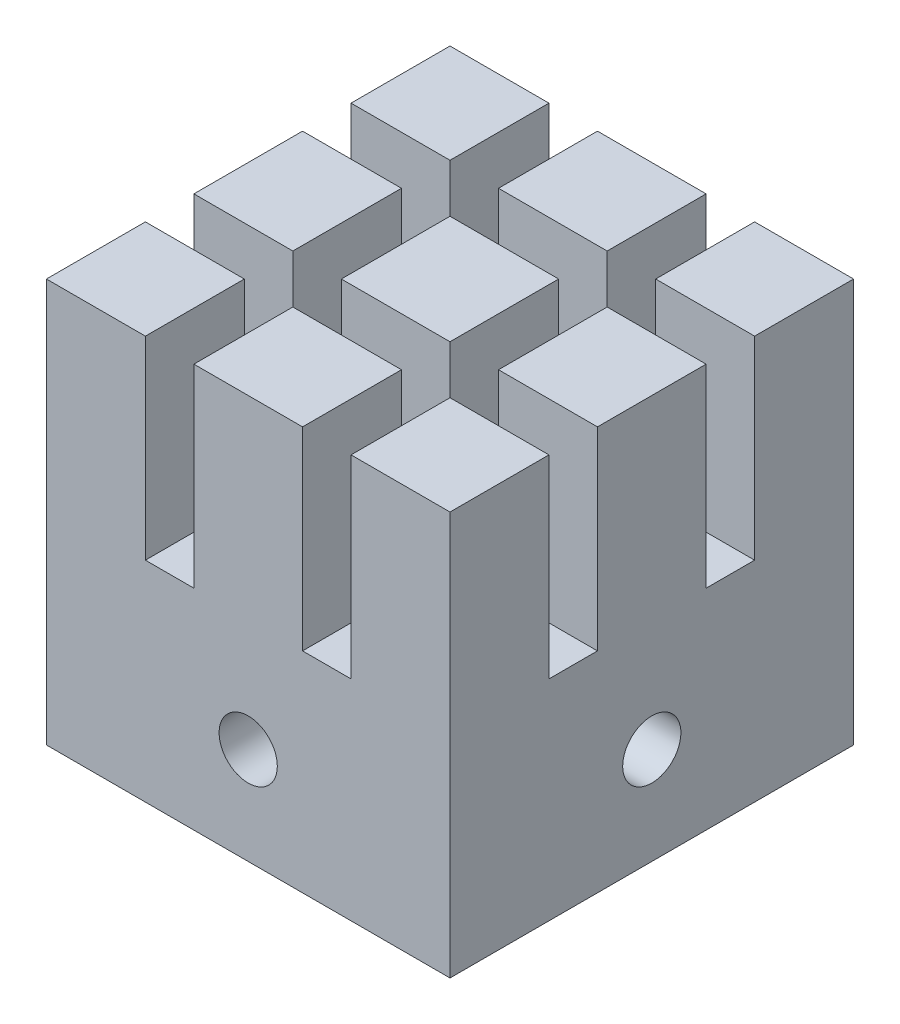
ISO-10303-21;
HEADER;
FILE_DESCRIPTION(('STEP AP214'),'2;1');
FILE_NAME('part.step','',(''),(''),'','','');
FILE_SCHEMA(('AUTOMOTIVE_DESIGN { 1 0 10303 214 1 1 1 1 }'));
ENDSEC;
DATA;
#1=APPLICATION_CONTEXT('core data for automotive mechanical design processes');
#2=APPLICATION_PROTOCOL_DEFINITION('international standard','automotive_design',2000,#1);
#3=PRODUCT_CONTEXT('',#1,'mechanical');
#4=PRODUCT('Part','Part','',(#3));
#5=PRODUCT_RELATED_PRODUCT_CATEGORY('part','',(#4));
#6=PRODUCT_DEFINITION_FORMATION('','',#4);
#7=PRODUCT_DEFINITION_CONTEXT('part definition',#1,'design');
#8=PRODUCT_DEFINITION('design','',#6,#7);
#9=PRODUCT_DEFINITION_SHAPE('','',#8);
#10=(LENGTH_UNIT() NAMED_UNIT(*) SI_UNIT(.MILLI.,.METRE.));
#11=(NAMED_UNIT(*) PLANE_ANGLE_UNIT() SI_UNIT($,.RADIAN.));
#12=(NAMED_UNIT(*) SI_UNIT($,.STERADIAN.) SOLID_ANGLE_UNIT());
#13=UNCERTAINTY_MEASURE_WITH_UNIT(LENGTH_MEASURE(1.E-05),#10,'distance_accuracy_value','');
#14=(GEOMETRIC_REPRESENTATION_CONTEXT(3) GLOBAL_UNCERTAINTY_ASSIGNED_CONTEXT((#13)) GLOBAL_UNIT_ASSIGNED_CONTEXT((#10,
#11,#12)) REPRESENTATION_CONTEXT('',''));
#15=CARTESIAN_POINT('',(0.,0.,0.));
#16=DIRECTION('',(0.,0.,1.));
#17=DIRECTION('',(1.,0.,0.));
#18=AXIS2_PLACEMENT_3D('',#15,#16,#17);
#19=CARTESIAN_POINT('',(5.08,-7.366,-26.416));
#20=DIRECTION('',(0.,0.,1.));
#21=DIRECTION('',(1.,0.,0.));
#22=AXIS2_PLACEMENT_3D('',#19,#20,#21);
#23=CYLINDRICAL_SURFACE('',#22,1.905);
#24=CARTESIAN_POINT('',(5.08,-7.366,0.));
#25=DIRECTION('',(0.,0.,1.));
#26=DIRECTION('',(1.,0.,0.));
#27=AXIS2_PLACEMENT_3D('',#24,#25,#26);
#28=CIRCLE('',#27,1.905);
#29=CARTESIAN_POINT('',(6.985,-7.366,0.));
#30=VERTEX_POINT('',#29);
#31=EDGE_CURVE('E600',#30,#30,#28,.T.);
#32=ORIENTED_EDGE('',*,*,#31,.T.);
#33=EDGE_LOOP('',(#32));
#34=FACE_BOUND('',#33,.T.);
#35=CARTESIAN_POINT('',(5.08,-7.366,-13.208));
#36=DIRECTION('',(-0.707106781186548,0.,0.707106781186547));
#37=DIRECTION('',(0.707106781186548,0.,0.707106781186547));
#38=AXIS2_PLACEMENT_3D('',#35,#36,#37);
#39=ELLIPSE('',#38,2.69407683632075,1.905);
#40=CARTESIAN_POINT('',(5.08,-5.461,-13.208));
#41=VERTEX_POINT('',#40);
#42=CARTESIAN_POINT('',(5.08,-9.271,-13.208));
#43=VERTEX_POINT('',#42);
#44=EDGE_CURVE('E144',#41,#43,#39,.F.);
#45=ORIENTED_EDGE('',*,*,#44,.T.);
#46=CARTESIAN_POINT('',(5.08,-7.366,-13.208));
#47=DIRECTION('',(0.707106781186548,0.,0.707106781186547));
#48=DIRECTION('',(-0.707106781186548,0.,0.707106781186547));
#49=AXIS2_PLACEMENT_3D('',#46,#47,#48);
#50=ELLIPSE('',#49,2.69407683632075,1.905);
#51=EDGE_CURVE('E12',#43,#41,#50,.F.);
#52=ORIENTED_EDGE('',*,*,#51,.T.);
#53=EDGE_LOOP('',(#45,#52));
#54=FACE_BOUND('',#53,.T.);
#55=ADVANCED_FACE('F131',(#34,#54),#23,.F.);
#56=CARTESIAN_POINT('',(-8.128,12.7,-26.416));
#57=DIRECTION('',(-1.,0.,0.));
#58=DIRECTION('',(0.,-1.,0.));
#59=AXIS2_PLACEMENT_3D('',#56,#57,#58);
#60=PLANE('',#59);
#61=CARTESIAN_POINT('',(-8.12800000000001,-7.36600000000001,-13.208));
#62=DIRECTION('',(1.,0.,0.));
#63=DIRECTION('',(0.,1.,0.));
#64=AXIS2_PLACEMENT_3D('',#61,#62,#63);
#65=CIRCLE('',#64,1.905);
#66=CARTESIAN_POINT('',(-8.12800000000001,-5.46100000000001,-13.208));
#67=VERTEX_POINT('',#66);
#68=EDGE_CURVE('E604',#67,#67,#65,.T.);
#69=ORIENTED_EDGE('',*,*,#68,.T.);
#70=EDGE_LOOP('',(#69));
#71=FACE_BOUND('',#70,.T.);
#72=DIRECTION('',(0.,1.,0.));
#73=VECTOR('',#72,1.);
#74=CARTESIAN_POINT('',(-8.128,0.,-6.477));
#75=LINE('',#74,#73);
#76=CARTESIAN_POINT('',(-8.128,0.,-6.477));
#77=VERTEX_POINT('',#76);
#78=CARTESIAN_POINT('',(-8.128,12.7,-6.477));
#79=VERTEX_POINT('',#78);
#80=EDGE_CURVE('E532',#77,#79,#75,.T.);
#81=ORIENTED_EDGE('',*,*,#80,.F.);
#82=DIRECTION('',(0.,0.,1.));
#83=VECTOR('',#82,1.);
#84=CARTESIAN_POINT('',(-8.128,0.,-9.652));
#85=LINE('',#84,#83);
#86=CARTESIAN_POINT('',(-8.128,0.,-9.652));
#87=VERTEX_POINT('',#86);
#88=EDGE_CURVE('E545',#87,#77,#85,.T.);
#89=ORIENTED_EDGE('',*,*,#88,.F.);
#90=DIRECTION('',(0.,1.,0.));
#91=VECTOR('',#90,1.);
#92=CARTESIAN_POINT('',(-8.128,0.,-9.652));
#93=LINE('',#92,#91);
#94=CARTESIAN_POINT('',(-8.128,12.7,-9.652));
#95=VERTEX_POINT('',#94);
#96=EDGE_CURVE('E451',#87,#95,#93,.T.);
#97=ORIENTED_EDGE('',*,*,#96,.T.);
#98=DIRECTION('',(0.,0.,1.));
#99=VECTOR('',#98,1.);
#100=CARTESIAN_POINT('',(-8.128,12.7,-26.416));
#101=LINE('',#100,#99);
#102=CARTESIAN_POINT('',(-8.128,12.7,-16.764));
#103=VERTEX_POINT('',#102);
#104=EDGE_CURVE('E396',#103,#95,#101,.T.);
#105=ORIENTED_EDGE('',*,*,#104,.F.);
#106=DIRECTION('',(0.,1.,0.));
#107=VECTOR('',#106,1.);
#108=CARTESIAN_POINT('',(-8.128,0.,-16.764));
#109=LINE('',#108,#107);
#110=CARTESIAN_POINT('',(-8.128,0.,-16.764));
#111=VERTEX_POINT('',#110);
#112=EDGE_CURVE('E500',#111,#103,#109,.T.);
#113=ORIENTED_EDGE('',*,*,#112,.F.);
#114=DIRECTION('',(0.,0.,1.));
#115=VECTOR('',#114,1.);
#116=CARTESIAN_POINT('',(-8.12800000000001,0.,-19.939));
#117=LINE('',#116,#115);
#118=CARTESIAN_POINT('',(-8.12800000000001,0.,-19.939));
#119=VERTEX_POINT('',#118);
#120=EDGE_CURVE('E522',#119,#111,#117,.T.);
#121=ORIENTED_EDGE('',*,*,#120,.F.);
#122=DIRECTION('',(0.,1.,0.));
#123=VECTOR('',#122,1.);
#124=CARTESIAN_POINT('',(-8.12800000000001,0.,-19.939));
#125=LINE('',#124,#123);
#126=CARTESIAN_POINT('',(-8.12800000000001,12.7,-19.939));
#127=VERTEX_POINT('',#126);
#128=EDGE_CURVE('E502',#119,#127,#125,.T.);
#129=ORIENTED_EDGE('',*,*,#128,.T.);
#130=CARTESIAN_POINT('',(-8.128,12.7,-26.416));
#131=VERTEX_POINT('',#130);
#132=EDGE_CURVE('E378',#131,#127,#101,.T.);
#133=ORIENTED_EDGE('',*,*,#132,.F.);
#134=DIRECTION('',(0.,-1.,0.));
#135=VECTOR('',#134,1.);
#136=CARTESIAN_POINT('',(-8.128,12.7,-26.416));
#137=LINE('',#136,#135);
#138=CARTESIAN_POINT('',(-8.128,-13.716,-26.416));
#139=VERTEX_POINT('',#138);
#140=EDGE_CURVE('E400',#131,#139,#137,.T.);
#141=ORIENTED_EDGE('',*,*,#140,.T.);
#142=DIRECTION('',(0.,0.,1.));
#143=VECTOR('',#142,1.);
#144=CARTESIAN_POINT('',(-8.128,-13.716,-26.416));
#145=LINE('',#144,#143);
#146=CARTESIAN_POINT('',(-8.128,-13.716,0.));
#147=VERTEX_POINT('',#146);
#148=EDGE_CURVE('E383',#139,#147,#145,.T.);
#149=ORIENTED_EDGE('',*,*,#148,.T.);
#150=DIRECTION('',(0.,-1.,0.));
#151=VECTOR('',#150,1.);
#152=CARTESIAN_POINT('',(-8.128,12.7,0.));
#153=LINE('',#152,#151);
#154=CARTESIAN_POINT('',(-8.128,12.7,0.));
#155=VERTEX_POINT('',#154);
#156=EDGE_CURVE('E409',#155,#147,#153,.T.);
#157=ORIENTED_EDGE('',*,*,#156,.F.);
#158=EDGE_CURVE('E392',#79,#155,#101,.T.);
#159=ORIENTED_EDGE('',*,*,#158,.F.);
#160=EDGE_LOOP('',(#81,#89,#97,#105,#113,#121,#129,#133,#141,#149,#157,#159));
#161=FACE_BOUND('',#160,.T.);
#162=ADVANCED_FACE('F133',(#71,#161),#60,.T.);
#163=CARTESIAN_POINT('',(-8.128,12.7,-26.416));
#164=DIRECTION('',(0.,1.,0.));
#165=DIRECTION('',(0.,0.,1.));
#166=AXIS2_PLACEMENT_3D('',#163,#164,#165);
#167=PLANE('',#166);
#168=DIRECTION('',(1.,0.,0.));
#169=VECTOR('',#168,1.);
#170=CARTESIAN_POINT('',(-8.128,12.7,-6.477));
#171=LINE('',#170,#169);
#172=CARTESIAN_POINT('',(11.811,12.7,-6.477));
#173=VERTEX_POINT('',#172);
#174=CARTESIAN_POINT('',(18.288,12.7,-6.477));
#175=VERTEX_POINT('',#174);
#176=EDGE_CURVE('E454',#173,#175,#171,.T.);
#177=ORIENTED_EDGE('',*,*,#176,.F.);
#178=DIRECTION('',(0.,0.,1.));
#179=VECTOR('',#178,1.);
#180=CARTESIAN_POINT('',(11.811,12.7,-26.416));
#181=LINE('',#180,#179);
#182=CARTESIAN_POINT('',(11.811,12.7,0.));
#183=VERTEX_POINT('',#182);
#184=EDGE_CURVE('E483',#173,#183,#181,.T.);
#185=ORIENTED_EDGE('',*,*,#184,.T.);
#186=DIRECTION('',(-1.,0.,0.));
#187=VECTOR('',#186,1.);
#188=CARTESIAN_POINT('',(-8.128,12.7,0.));
#189=LINE('',#188,#187);
#190=CARTESIAN_POINT('',(18.288,12.7,0.));
#191=VERTEX_POINT('',#190);
#192=EDGE_CURVE('E397',#191,#183,#189,.T.);
#193=ORIENTED_EDGE('',*,*,#192,.F.);
#194=DIRECTION('',(0.,0.,1.));
#195=VECTOR('',#194,1.);
#196=CARTESIAN_POINT('',(18.288,12.7,-26.416));
#197=LINE('',#196,#195);
#198=EDGE_CURVE('E388',#175,#191,#197,.T.);
#199=ORIENTED_EDGE('',*,*,#198,.F.);
#200=EDGE_LOOP('',(#177,#185,#193,#199));
#201=FACE_BOUND('',#200,.T.);
#202=ADVANCED_FACE('F627',(#201),#167,.T.);
#203=DIRECTION('',(-1.,0.,0.));
#204=VECTOR('',#203,1.);
#205=CARTESIAN_POINT('',(-8.128,12.7,-26.416));
#206=LINE('',#205,#204);
#207=CARTESIAN_POINT('',(18.288,12.7,-26.416));
#208=VERTEX_POINT('',#207);
#209=CARTESIAN_POINT('',(11.811,12.7,-26.416));
#210=VERTEX_POINT('',#209);
#211=EDGE_CURVE('E386',#208,#210,#206,.T.);
#212=ORIENTED_EDGE('',*,*,#211,.T.);
#213=CARTESIAN_POINT('',(11.811,12.7,-19.939));
#214=VERTEX_POINT('',#213);
#215=EDGE_CURVE('E479',#210,#214,#181,.T.);
#216=ORIENTED_EDGE('',*,*,#215,.T.);
#217=DIRECTION('',(-1.,0.,0.));
#218=VECTOR('',#217,1.);
#219=CARTESIAN_POINT('',(18.288,12.7,-19.939));
#220=LINE('',#219,#218);
#221=CARTESIAN_POINT('',(18.288,12.7,-19.939));
#222=VERTEX_POINT('',#221);
#223=EDGE_CURVE('E508',#222,#214,#220,.T.);
#224=ORIENTED_EDGE('',*,*,#223,.F.);
#225=EDGE_CURVE('E389',#208,#222,#197,.T.);
#226=ORIENTED_EDGE('',*,*,#225,.F.);
#227=EDGE_LOOP('',(#212,#216,#224,#226));
#228=FACE_BOUND('',#227,.T.);
#229=ADVANCED_FACE('F865',(#228),#167,.T.);
#230=CARTESIAN_POINT('',(11.811,12.7,-16.764));
#231=VERTEX_POINT('',#230);
#232=CARTESIAN_POINT('',(11.811,12.7,-9.652));
#233=VERTEX_POINT('',#232);
#234=EDGE_CURVE('E482',#231,#233,#181,.T.);
#235=ORIENTED_EDGE('',*,*,#234,.T.);
#236=DIRECTION('',(1.,0.,0.));
#237=VECTOR('',#236,1.);
#238=CARTESIAN_POINT('',(-8.128,12.7,-9.652));
#239=LINE('',#238,#237);
#240=CARTESIAN_POINT('',(18.288,12.7,-9.652));
#241=VERTEX_POINT('',#240);
#242=EDGE_CURVE('E547',#233,#241,#239,.T.);
#243=ORIENTED_EDGE('',*,*,#242,.T.);
#244=CARTESIAN_POINT('',(18.288,12.7,-16.764));
#245=VERTEX_POINT('',#244);
#246=EDGE_CURVE('E393',#245,#241,#197,.T.);
#247=ORIENTED_EDGE('',*,*,#246,.F.);
#248=DIRECTION('',(-1.,0.,0.));
#249=VECTOR('',#248,1.);
#250=CARTESIAN_POINT('',(18.288,12.7,-16.764));
#251=LINE('',#250,#249);
#252=EDGE_CURVE('E514',#245,#231,#251,.T.);
#253=ORIENTED_EDGE('',*,*,#252,.T.);
#254=EDGE_LOOP('',(#235,#243,#247,#253));
#255=FACE_BOUND('',#254,.T.);
#256=ADVANCED_FACE('F656',(#255),#167,.T.);
#257=CARTESIAN_POINT('',(1.524,12.7,-6.47700000000001));
#258=VERTEX_POINT('',#257);
#259=CARTESIAN_POINT('',(8.636,12.7,-6.477));
#260=VERTEX_POINT('',#259);
#261=EDGE_CURVE('E551',#258,#260,#171,.T.);
#262=ORIENTED_EDGE('',*,*,#261,.F.);
#263=DIRECTION('',(0.,0.,1.));
#264=VECTOR('',#263,1.);
#265=CARTESIAN_POINT('',(1.524,12.7,-26.416));
#266=LINE('',#265,#264);
#267=CARTESIAN_POINT('',(1.524,12.7,0.));
#268=VERTEX_POINT('',#267);
#269=EDGE_CURVE('E443',#258,#268,#266,.T.);
#270=ORIENTED_EDGE('',*,*,#269,.T.);
#271=CARTESIAN_POINT('',(8.636,12.7,0.));
#272=VERTEX_POINT('',#271);
#273=EDGE_CURVE('E401',#272,#268,#189,.T.);
#274=ORIENTED_EDGE('',*,*,#273,.F.);
#275=DIRECTION('',(0.,0.,1.));
#276=VECTOR('',#275,1.);
#277=CARTESIAN_POINT('',(8.636,12.7,-26.416));
#278=LINE('',#277,#276);
#279=EDGE_CURVE('E478',#260,#272,#278,.T.);
#280=ORIENTED_EDGE('',*,*,#279,.F.);
#281=EDGE_LOOP('',(#262,#270,#274,#280));
#282=FACE_BOUND('',#281,.T.);
#283=ADVANCED_FACE('F638',(#282),#167,.T.);
#284=DIRECTION('',(0.,0.,1.));
#285=VECTOR('',#284,1.);
#286=CARTESIAN_POINT('',(-1.651,12.7,-26.416));
#287=LINE('',#286,#285);
#288=CARTESIAN_POINT('',(-1.651,12.7,-6.47700000000001));
#289=VERTEX_POINT('',#288);
#290=CARTESIAN_POINT('',(-1.651,12.7,0.));
#291=VERTEX_POINT('',#290);
#292=EDGE_CURVE('E581',#289,#291,#287,.T.);
#293=ORIENTED_EDGE('',*,*,#292,.F.);
#294=EDGE_CURVE('E548',#79,#289,#171,.T.);
#295=ORIENTED_EDGE('',*,*,#294,.F.);
#296=ORIENTED_EDGE('',*,*,#158,.T.);
#297=EDGE_CURVE('E402',#291,#155,#189,.T.);
#298=ORIENTED_EDGE('',*,*,#297,.F.);
#299=EDGE_LOOP('',(#293,#295,#296,#298));
#300=FACE_BOUND('',#299,.T.);
#301=ADVANCED_FACE('F637',(#300),#167,.T.);
#302=ORIENTED_EDGE('',*,*,#104,.T.);
#303=CARTESIAN_POINT('',(-1.651,12.7,-9.652));
#304=VERTEX_POINT('',#303);
#305=EDGE_CURVE('E542',#95,#304,#239,.T.);
#306=ORIENTED_EDGE('',*,*,#305,.T.);
#307=CARTESIAN_POINT('',(-1.651,12.7,-16.764));
#308=VERTEX_POINT('',#307);
#309=EDGE_CURVE('E580',#308,#304,#287,.T.);
#310=ORIENTED_EDGE('',*,*,#309,.F.);
#311=EDGE_CURVE('E465',#308,#103,#251,.T.);
#312=ORIENTED_EDGE('',*,*,#311,.T.);
#313=EDGE_LOOP('',(#302,#306,#310,#312));
#314=FACE_BOUND('',#313,.T.);
#315=ADVANCED_FACE('F653',(#314),#167,.T.);
#316=CARTESIAN_POINT('',(8.636,12.7,-26.416));
#317=VERTEX_POINT('',#316);
#318=CARTESIAN_POINT('',(8.636,12.7,-19.939));
#319=VERTEX_POINT('',#318);
#320=EDGE_CURVE('E474',#317,#319,#278,.T.);
#321=ORIENTED_EDGE('',*,*,#320,.F.);
#322=CARTESIAN_POINT('',(1.524,12.7,-26.416));
#323=VERTEX_POINT('',#322);
#324=EDGE_CURVE('E415',#317,#323,#206,.T.);
#325=ORIENTED_EDGE('',*,*,#324,.T.);
#326=CARTESIAN_POINT('',(1.524,12.7,-19.939));
#327=VERTEX_POINT('',#326);
#328=EDGE_CURVE('E582',#323,#327,#266,.T.);
#329=ORIENTED_EDGE('',*,*,#328,.T.);
#330=EDGE_CURVE('E512',#319,#327,#220,.T.);
#331=ORIENTED_EDGE('',*,*,#330,.F.);
#332=EDGE_LOOP('',(#321,#325,#329,#331));
#333=FACE_BOUND('',#332,.T.);
#334=ADVANCED_FACE('F849',(#333),#167,.T.);
#335=CARTESIAN_POINT('',(0.,0.,-26.416));
#336=DIRECTION('',(0.,0.,1.));
#337=DIRECTION('',(1.,0.,0.));
#338=AXIS2_PLACEMENT_3D('',#335,#336,#337);
#339=PLANE('',#338);
#340=CARTESIAN_POINT('',(5.08,-7.366,-26.416));
#341=DIRECTION('',(0.,0.,1.));
#342=DIRECTION('',(1.,0.,0.));
#343=AXIS2_PLACEMENT_3D('',#340,#341,#342);
#344=CIRCLE('',#343,1.905);
#345=CARTESIAN_POINT('',(6.985,-7.366,-26.416));
#346=VERTEX_POINT('',#345);
#347=EDGE_CURVE('E603',#346,#346,#344,.T.);
#348=ORIENTED_EDGE('',*,*,#347,.T.);
#349=EDGE_LOOP('',(#348));
#350=FACE_BOUND('',#349,.T.);
#351=DIRECTION('',(0.,1.,0.));
#352=VECTOR('',#351,1.);
#353=CARTESIAN_POINT('',(11.811,0.,-26.416));
#354=LINE('',#353,#352);
#355=CARTESIAN_POINT('',(11.811,0.,-26.416));
#356=VERTEX_POINT('',#355);
#357=EDGE_CURVE('E462',#356,#210,#354,.T.);
#358=ORIENTED_EDGE('',*,*,#357,.T.);
#359=ORIENTED_EDGE('',*,*,#211,.F.);
#360=DIRECTION('',(0.,1.,0.));
#361=VECTOR('',#360,1.);
#362=CARTESIAN_POINT('',(18.288,12.7,-26.416));
#363=LINE('',#362,#361);
#364=CARTESIAN_POINT('',(18.288,-13.716,-26.416));
#365=VERTEX_POINT('',#364);
#366=EDGE_CURVE('E417',#365,#208,#363,.T.);
#367=ORIENTED_EDGE('',*,*,#366,.F.);
#368=DIRECTION('',(1.,0.,0.));
#369=VECTOR('',#368,1.);
#370=CARTESIAN_POINT('',(-8.128,-13.716,-26.416));
#371=LINE('',#370,#369);
#372=EDGE_CURVE('E420',#139,#365,#371,.T.);
#373=ORIENTED_EDGE('',*,*,#372,.F.);
#374=ORIENTED_EDGE('',*,*,#140,.F.);
#375=CARTESIAN_POINT('',(-1.651,12.7,-26.416));
#376=VERTEX_POINT('',#375);
#377=EDGE_CURVE('E416',#376,#131,#206,.T.);
#378=ORIENTED_EDGE('',*,*,#377,.F.);
#379=DIRECTION('',(0.,1.,0.));
#380=VECTOR('',#379,1.);
#381=CARTESIAN_POINT('',(-1.651,0.,-26.416));
#382=LINE('',#381,#380);
#383=CARTESIAN_POINT('',(-1.651,0.,-26.416));
#384=VERTEX_POINT('',#383);
#385=EDGE_CURVE('E573',#384,#376,#382,.T.);
#386=ORIENTED_EDGE('',*,*,#385,.F.);
#387=DIRECTION('',(1.,0.,0.));
#388=VECTOR('',#387,1.);
#389=CARTESIAN_POINT('',(-1.651,0.,-26.416));
#390=LINE('',#389,#388);
#391=CARTESIAN_POINT('',(1.524,0.,-26.416));
#392=VERTEX_POINT('',#391);
#393=EDGE_CURVE('E579',#384,#392,#390,.T.);
#394=ORIENTED_EDGE('',*,*,#393,.T.);
#395=DIRECTION('',(0.,1.,0.));
#396=VECTOR('',#395,1.);
#397=CARTESIAN_POINT('',(1.524,0.,-26.416));
#398=LINE('',#397,#396);
#399=EDGE_CURVE('E440',#392,#323,#398,.T.);
#400=ORIENTED_EDGE('',*,*,#399,.T.);
#401=ORIENTED_EDGE('',*,*,#324,.F.);
#402=DIRECTION('',(0.,1.,0.));
#403=VECTOR('',#402,1.);
#404=CARTESIAN_POINT('',(8.636,0.,-26.416));
#405=LINE('',#404,#403);
#406=CARTESIAN_POINT('',(8.636,0.,-26.416));
#407=VERTEX_POINT('',#406);
#408=EDGE_CURVE('E471',#407,#317,#405,.T.);
#409=ORIENTED_EDGE('',*,*,#408,.F.);
#410=DIRECTION('',(1.,0.,0.));
#411=VECTOR('',#410,1.);
#412=CARTESIAN_POINT('',(8.636,0.,-26.416));
#413=LINE('',#412,#411);
#414=EDGE_CURVE('E477',#407,#356,#413,.T.);
#415=ORIENTED_EDGE('',*,*,#414,.T.);
#416=EDGE_LOOP('',(#358,#359,#367,#373,#374,#378,#386,#394,#400,#401,#409,#415));
#417=FACE_BOUND('',#416,.T.);
#418=ADVANCED_FACE('F770',(#350,#417),#339,.F.);
#419=CARTESIAN_POINT('',(0.,0.,0.));
#420=DIRECTION('',(0.,0.,1.));
#421=DIRECTION('',(1.,0.,0.));
#422=AXIS2_PLACEMENT_3D('',#419,#420,#421);
#423=PLANE('',#422);
#424=ORIENTED_EDGE('',*,*,#31,.F.);
#425=EDGE_LOOP('',(#424));
#426=FACE_BOUND('',#425,.T.);
#427=ORIENTED_EDGE('',*,*,#273,.T.);
#428=DIRECTION('',(0.,1.,0.));
#429=VECTOR('',#428,1.);
#430=CARTESIAN_POINT('',(1.524,0.,0.));
#431=LINE('',#430,#429);
#432=CARTESIAN_POINT('',(1.524,0.,0.));
#433=VERTEX_POINT('',#432);
#434=EDGE_CURVE('E568',#433,#268,#431,.T.);
#435=ORIENTED_EDGE('',*,*,#434,.F.);
#436=DIRECTION('',(1.,0.,0.));
#437=VECTOR('',#436,1.);
#438=CARTESIAN_POINT('',(-1.651,0.,0.));
#439=LINE('',#438,#437);
#440=CARTESIAN_POINT('',(-1.651,0.,0.));
#441=VERTEX_POINT('',#440);
#442=EDGE_CURVE('E590',#441,#433,#439,.T.);
#443=ORIENTED_EDGE('',*,*,#442,.F.);
#444=DIRECTION('',(0.,1.,0.));
#445=VECTOR('',#444,1.);
#446=CARTESIAN_POINT('',(-1.651,0.,0.));
#447=LINE('',#446,#445);
#448=EDGE_CURVE('E570',#441,#291,#447,.T.);
#449=ORIENTED_EDGE('',*,*,#448,.T.);
#450=ORIENTED_EDGE('',*,*,#297,.T.);
#451=ORIENTED_EDGE('',*,*,#156,.T.);
#452=DIRECTION('',(1.,0.,0.));
#453=VECTOR('',#452,1.);
#454=CARTESIAN_POINT('',(-8.128,-13.716,0.));
#455=LINE('',#454,#453);
#456=CARTESIAN_POINT('',(18.288,-13.716,0.));
#457=VERTEX_POINT('',#456);
#458=EDGE_CURVE('E406',#147,#457,#455,.T.);
#459=ORIENTED_EDGE('',*,*,#458,.T.);
#460=DIRECTION('',(0.,1.,0.));
#461=VECTOR('',#460,1.);
#462=CARTESIAN_POINT('',(18.288,12.7,0.));
#463=LINE('',#462,#461);
#464=EDGE_CURVE('E403',#457,#191,#463,.T.);
#465=ORIENTED_EDGE('',*,*,#464,.T.);
#466=ORIENTED_EDGE('',*,*,#192,.T.);
#467=DIRECTION('',(0.,1.,0.));
#468=VECTOR('',#467,1.);
#469=CARTESIAN_POINT('',(11.811,0.,0.));
#470=LINE('',#469,#468);
#471=CARTESIAN_POINT('',(11.811,0.,0.));
#472=VERTEX_POINT('',#471);
#473=EDGE_CURVE('E466',#472,#183,#470,.T.);
#474=ORIENTED_EDGE('',*,*,#473,.F.);
#475=DIRECTION('',(1.,0.,0.));
#476=VECTOR('',#475,1.);
#477=CARTESIAN_POINT('',(8.636,0.,0.));
#478=LINE('',#477,#476);
#479=CARTESIAN_POINT('',(8.636,0.,0.));
#480=VERTEX_POINT('',#479);
#481=EDGE_CURVE('E488',#480,#472,#478,.T.);
#482=ORIENTED_EDGE('',*,*,#481,.F.);
#483=DIRECTION('',(0.,1.,0.));
#484=VECTOR('',#483,1.);
#485=CARTESIAN_POINT('',(8.636,0.,0.));
#486=LINE('',#485,#484);
#487=EDGE_CURVE('E468',#480,#272,#486,.T.);
#488=ORIENTED_EDGE('',*,*,#487,.T.);
#489=EDGE_LOOP('',(#427,#435,#443,#449,#450,#451,#459,#465,#466,#474,#482,#488));
#490=FACE_BOUND('',#489,.T.);
#491=ADVANCED_FACE('F741',(#426,#490),#423,.T.);
#492=CARTESIAN_POINT('',(-1.651,12.7,-19.939));
#493=VERTEX_POINT('',#492);
#494=EDGE_CURVE('E576',#376,#493,#287,.T.);
#495=ORIENTED_EDGE('',*,*,#494,.F.);
#496=ORIENTED_EDGE('',*,*,#377,.T.);
#497=ORIENTED_EDGE('',*,*,#132,.T.);
#498=EDGE_CURVE('E513',#493,#127,#220,.T.);
#499=ORIENTED_EDGE('',*,*,#498,.F.);
#500=EDGE_LOOP('',(#495,#496,#497,#499));
#501=FACE_BOUND('',#500,.T.);
#502=ADVANCED_FACE('F649',(#501),#167,.T.);
#503=CARTESIAN_POINT('',(18.288,12.7,-26.416));
#504=DIRECTION('',(1.,0.,0.));
#505=DIRECTION('',(0.,1.,0.));
#506=AXIS2_PLACEMENT_3D('',#503,#504,#505);
#507=PLANE('',#506);
#508=CARTESIAN_POINT('',(18.288,-7.366,-13.208));
#509=DIRECTION('',(1.,0.,0.));
#510=DIRECTION('',(0.,1.,0.));
#511=AXIS2_PLACEMENT_3D('',#508,#509,#510);
#512=CIRCLE('',#511,1.905);
#513=CARTESIAN_POINT('',(18.288,-5.461,-13.208));
#514=VERTEX_POINT('',#513);
#515=EDGE_CURVE('E607',#514,#514,#512,.T.);
#516=ORIENTED_EDGE('',*,*,#515,.F.);
#517=EDGE_LOOP('',(#516));
#518=FACE_BOUND('',#517,.T.);
#519=DIRECTION('',(0.,1.,0.));
#520=VECTOR('',#519,1.);
#521=CARTESIAN_POINT('',(18.288,0.,-6.477));
#522=LINE('',#521,#520);
#523=CARTESIAN_POINT('',(18.288,0.,-6.477));
#524=VERTEX_POINT('',#523);
#525=EDGE_CURVE('E534',#524,#175,#522,.T.);
#526=ORIENTED_EDGE('',*,*,#525,.T.);
#527=ORIENTED_EDGE('',*,*,#198,.T.);
#528=ORIENTED_EDGE('',*,*,#464,.F.);
#529=DIRECTION('',(0.,0.,1.));
#530=VECTOR('',#529,1.);
#531=CARTESIAN_POINT('',(18.288,-13.716,-26.416));
#532=LINE('',#531,#530);
#533=EDGE_CURVE('E385',#365,#457,#532,.T.);
#534=ORIENTED_EDGE('',*,*,#533,.F.);
#535=ORIENTED_EDGE('',*,*,#366,.T.);
#536=ORIENTED_EDGE('',*,*,#225,.T.);
#537=DIRECTION('',(0.,1.,0.));
#538=VECTOR('',#537,1.);
#539=CARTESIAN_POINT('',(18.288,0.,-19.939));
#540=LINE('',#539,#538);
#541=CARTESIAN_POINT('',(18.288,0.,-19.939));
#542=VERTEX_POINT('',#541);
#543=EDGE_CURVE('E505',#542,#222,#540,.T.);
#544=ORIENTED_EDGE('',*,*,#543,.F.);
#545=DIRECTION('',(0.,0.,1.));
#546=VECTOR('',#545,1.);
#547=CARTESIAN_POINT('',(18.288,0.,-19.939));
#548=LINE('',#547,#546);
#549=CARTESIAN_POINT('',(18.288,0.,-16.764));
#550=VERTEX_POINT('',#549);
#551=EDGE_CURVE('E511',#542,#550,#548,.T.);
#552=ORIENTED_EDGE('',*,*,#551,.T.);
#553=DIRECTION('',(0.,1.,0.));
#554=VECTOR('',#553,1.);
#555=CARTESIAN_POINT('',(18.288,0.,-16.764));
#556=LINE('',#555,#554);
#557=EDGE_CURVE('E461',#550,#245,#556,.T.);
#558=ORIENTED_EDGE('',*,*,#557,.T.);
#559=ORIENTED_EDGE('',*,*,#246,.T.);
#560=DIRECTION('',(0.,1.,0.));
#561=VECTOR('',#560,1.);
#562=CARTESIAN_POINT('',(18.288,0.,-9.652));
#563=LINE('',#562,#561);
#564=CARTESIAN_POINT('',(18.288,0.,-9.652));
#565=VERTEX_POINT('',#564);
#566=EDGE_CURVE('E538',#565,#241,#563,.T.);
#567=ORIENTED_EDGE('',*,*,#566,.F.);
#568=DIRECTION('',(0.,0.,1.));
#569=VECTOR('',#568,1.);
#570=CARTESIAN_POINT('',(18.288,0.,-9.652));
#571=LINE('',#570,#569);
#572=EDGE_CURVE('E556',#565,#524,#571,.T.);
#573=ORIENTED_EDGE('',*,*,#572,.T.);
#574=EDGE_LOOP('',(#526,#527,#528,#534,#535,#536,#544,#552,#558,#559,#567,#573));
#575=FACE_BOUND('',#574,.T.);
#576=ADVANCED_FACE('F671',(#518,#575),#507,.T.);
#577=CARTESIAN_POINT('',(-8.128,-13.716,-26.416));
#578=DIRECTION('',(0.,-1.,0.));
#579=DIRECTION('',(0.,0.,-1.));
#580=AXIS2_PLACEMENT_3D('',#577,#578,#579);
#581=PLANE('',#580);
#582=ORIENTED_EDGE('',*,*,#458,.F.);
#583=ORIENTED_EDGE('',*,*,#148,.F.);
#584=ORIENTED_EDGE('',*,*,#372,.T.);
#585=ORIENTED_EDGE('',*,*,#533,.T.);
#586=EDGE_LOOP('',(#582,#583,#584,#585));
#587=FACE_BOUND('',#586,.T.);
#588=ADVANCED_FACE('F659',(#587),#581,.T.);
#589=CARTESIAN_POINT('',(0.,0.,0.));
#590=DIRECTION('',(0.,-1.,0.));
#591=DIRECTION('',(0.,0.,-1.));
#592=AXIS2_PLACEMENT_3D('',#589,#590,#591);
#593=PLANE('',#592);
#594=DIRECTION('',(0.,0.,1.));
#595=VECTOR('',#594,1.);
#596=CARTESIAN_POINT('',(8.636,0.,-26.416));
#597=LINE('',#596,#595);
#598=CARTESIAN_POINT('',(8.636,0.,-16.764));
#599=VERTEX_POINT('',#598);
#600=CARTESIAN_POINT('',(8.636,0.,-9.652));
#601=VERTEX_POINT('',#600);
#602=EDGE_CURVE('E486',#599,#601,#597,.T.);
#603=ORIENTED_EDGE('',*,*,#602,.T.);
#604=DIRECTION('',(1.,0.,0.));
#605=VECTOR('',#604,1.);
#606=CARTESIAN_POINT('',(-8.128,0.,-9.652));
#607=LINE('',#606,#605);
#608=CARTESIAN_POINT('',(1.524,0.,-9.652));
#609=VERTEX_POINT('',#608);
#610=EDGE_CURVE('E554',#609,#601,#607,.T.);
#611=ORIENTED_EDGE('',*,*,#610,.F.);
#612=DIRECTION('',(0.,0.,1.));
#613=VECTOR('',#612,1.);
#614=CARTESIAN_POINT('',(1.524,0.,-26.416));
#615=LINE('',#614,#613);
#616=CARTESIAN_POINT('',(1.524,0.,-16.764));
#617=VERTEX_POINT('',#616);
#618=EDGE_CURVE('E596',#617,#609,#615,.T.);
#619=ORIENTED_EDGE('',*,*,#618,.F.);
#620=DIRECTION('',(-1.,0.,0.));
#621=VECTOR('',#620,1.);
#622=CARTESIAN_POINT('',(18.288,0.,-16.764));
#623=LINE('',#622,#621);
#624=EDGE_CURVE('E528',#599,#617,#623,.T.);
#625=ORIENTED_EDGE('',*,*,#624,.F.);
#626=EDGE_LOOP('',(#603,#611,#619,#625));
#627=FACE_BOUND('',#626,.T.);
#628=DIRECTION('',(0.,0.,1.));
#629=VECTOR('',#628,1.);
#630=CARTESIAN_POINT('',(-1.651,0.,-26.416));
#631=LINE('',#630,#629);
#632=CARTESIAN_POINT('',(-1.651,0.,-16.764));
#633=VERTEX_POINT('',#632);
#634=CARTESIAN_POINT('',(-1.651,0.,-9.652));
#635=VERTEX_POINT('',#634);
#636=EDGE_CURVE('E588',#633,#635,#631,.T.);
#637=ORIENTED_EDGE('',*,*,#636,.T.);
#638=EDGE_CURVE('E535',#87,#635,#607,.T.);
#639=ORIENTED_EDGE('',*,*,#638,.F.);
#640=ORIENTED_EDGE('',*,*,#88,.T.);
#641=DIRECTION('',(1.,0.,0.));
#642=VECTOR('',#641,1.);
#643=CARTESIAN_POINT('',(-8.128,0.,-6.477));
#644=LINE('',#643,#642);
#645=CARTESIAN_POINT('',(-1.651,0.,-6.47700000000001));
#646=VERTEX_POINT('',#645);
#647=EDGE_CURVE('E559',#77,#646,#644,.T.);
#648=ORIENTED_EDGE('',*,*,#647,.T.);
#649=EDGE_CURVE('E589',#646,#441,#631,.T.);
#650=ORIENTED_EDGE('',*,*,#649,.T.);
#651=ORIENTED_EDGE('',*,*,#442,.T.);
#652=CARTESIAN_POINT('',(1.524,0.,-6.47700000000001));
#653=VERTEX_POINT('',#652);
#654=EDGE_CURVE('E597',#653,#433,#615,.T.);
#655=ORIENTED_EDGE('',*,*,#654,.F.);
#656=CARTESIAN_POINT('',(8.636,0.,-6.477));
#657=VERTEX_POINT('',#656);
#658=EDGE_CURVE('E562',#653,#657,#644,.T.);
#659=ORIENTED_EDGE('',*,*,#658,.T.);
#660=EDGE_CURVE('E487',#657,#480,#597,.T.);
#661=ORIENTED_EDGE('',*,*,#660,.T.);
#662=ORIENTED_EDGE('',*,*,#481,.T.);
#663=DIRECTION('',(0.,0.,1.));
#664=VECTOR('',#663,1.);
#665=CARTESIAN_POINT('',(11.811,0.,-26.416));
#666=LINE('',#665,#664);
#667=CARTESIAN_POINT('',(11.811,0.,-6.477));
#668=VERTEX_POINT('',#667);
#669=EDGE_CURVE('E495',#668,#472,#666,.T.);
#670=ORIENTED_EDGE('',*,*,#669,.F.);
#671=EDGE_CURVE('E563',#668,#524,#644,.T.);
#672=ORIENTED_EDGE('',*,*,#671,.T.);
#673=ORIENTED_EDGE('',*,*,#572,.F.);
#674=CARTESIAN_POINT('',(11.811,0.,-9.652));
#675=VERTEX_POINT('',#674);
#676=EDGE_CURVE('E555',#675,#565,#607,.T.);
#677=ORIENTED_EDGE('',*,*,#676,.F.);
#678=CARTESIAN_POINT('',(11.811,0.,-16.764));
#679=VERTEX_POINT('',#678);
#680=EDGE_CURVE('E494',#679,#675,#666,.T.);
#681=ORIENTED_EDGE('',*,*,#680,.F.);
#682=EDGE_CURVE('E525',#550,#679,#623,.T.);
#683=ORIENTED_EDGE('',*,*,#682,.F.);
#684=ORIENTED_EDGE('',*,*,#551,.F.);
#685=DIRECTION('',(-1.,0.,0.));
#686=VECTOR('',#685,1.);
#687=CARTESIAN_POINT('',(18.288,0.,-19.939));
#688=LINE('',#687,#686);
#689=CARTESIAN_POINT('',(11.811,0.,-19.939));
#690=VERTEX_POINT('',#689);
#691=EDGE_CURVE('E507',#542,#690,#688,.T.);
#692=ORIENTED_EDGE('',*,*,#691,.T.);
#693=EDGE_CURVE('E491',#356,#690,#666,.T.);
#694=ORIENTED_EDGE('',*,*,#693,.F.);
#695=ORIENTED_EDGE('',*,*,#414,.F.);
#696=CARTESIAN_POINT('',(8.636,0.,-19.939));
#697=VERTEX_POINT('',#696);
#698=EDGE_CURVE('E473',#407,#697,#597,.T.);
#699=ORIENTED_EDGE('',*,*,#698,.T.);
#700=CARTESIAN_POINT('',(1.524,0.,-19.939));
#701=VERTEX_POINT('',#700);
#702=EDGE_CURVE('E520',#697,#701,#688,.T.);
#703=ORIENTED_EDGE('',*,*,#702,.T.);
#704=EDGE_CURVE('E593',#392,#701,#615,.T.);
#705=ORIENTED_EDGE('',*,*,#704,.F.);
#706=ORIENTED_EDGE('',*,*,#393,.F.);
#707=CARTESIAN_POINT('',(-1.651,0.,-19.939));
#708=VERTEX_POINT('',#707);
#709=EDGE_CURVE('E575',#384,#708,#631,.T.);
#710=ORIENTED_EDGE('',*,*,#709,.T.);
#711=EDGE_CURVE('E521',#708,#119,#688,.T.);
#712=ORIENTED_EDGE('',*,*,#711,.T.);
#713=ORIENTED_EDGE('',*,*,#120,.T.);
#714=EDGE_CURVE('E529',#633,#111,#623,.T.);
#715=ORIENTED_EDGE('',*,*,#714,.F.);
#716=EDGE_LOOP('',(#637,#639,#640,#648,#650,#651,#655,#659,#661,#662,#670,#672,#673,#677,#681,
#683,#684,#692,#694,#695,#699,#703,#705,#706,#710,#712,#713,#715));
#717=FACE_BOUND('',#716,.T.);
#718=ADVANCED_FACE('F639',(#627,#717),#593,.F.);
#719=CARTESIAN_POINT('',(1.524,0.,-26.416));
#720=DIRECTION('',(-1.,0.,0.));
#721=DIRECTION('',(0.,0.,1.));
#722=AXIS2_PLACEMENT_3D('',#719,#720,#721);
#723=PLANE('',#722);
#724=ORIENTED_EDGE('',*,*,#654,.T.);
#725=ORIENTED_EDGE('',*,*,#434,.T.);
#726=ORIENTED_EDGE('',*,*,#269,.F.);
#727=DIRECTION('',(0.,1.,0.));
#728=VECTOR('',#727,1.);
#729=CARTESIAN_POINT('',(1.524,0.,-6.477));
#730=LINE('',#729,#728);
#731=EDGE_CURVE('E412',#653,#258,#730,.T.);
#732=ORIENTED_EDGE('',*,*,#731,.F.);
#733=EDGE_LOOP('',(#724,#725,#726,#732));
#734=FACE_BOUND('',#733,.T.);
#735=ADVANCED_FACE('F648',(#734),#723,.T.);
#736=CARTESIAN_POINT('',(-1.651,0.,-26.416));
#737=DIRECTION('',(-1.,0.,0.));
#738=DIRECTION('',(0.,0.,1.));
#739=AXIS2_PLACEMENT_3D('',#736,#737,#738);
#740=PLANE('',#739);
#741=DIRECTION('',(0.,1.,0.));
#742=VECTOR('',#741,1.);
#743=CARTESIAN_POINT('',(-1.651,0.,-6.477));
#744=LINE('',#743,#742);
#745=EDGE_CURVE('E427',#646,#289,#744,.T.);
#746=ORIENTED_EDGE('',*,*,#745,.T.);
#747=ORIENTED_EDGE('',*,*,#292,.T.);
#748=ORIENTED_EDGE('',*,*,#448,.F.);
#749=ORIENTED_EDGE('',*,*,#649,.F.);
#750=EDGE_LOOP('',(#746,#747,#748,#749));
#751=FACE_BOUND('',#750,.T.);
#752=ADVANCED_FACE('F666',(#751),#740,.F.);
#753=DIRECTION('',(0.,1.,0.));
#754=VECTOR('',#753,1.);
#755=CARTESIAN_POINT('',(1.524,0.,-9.652));
#756=LINE('',#755,#754);
#757=CARTESIAN_POINT('',(1.524,12.7,-9.652));
#758=VERTEX_POINT('',#757);
#759=EDGE_CURVE('E426',#609,#758,#756,.T.);
#760=ORIENTED_EDGE('',*,*,#759,.T.);
#761=CARTESIAN_POINT('',(1.524,12.7,-16.764));
#762=VERTEX_POINT('',#761);
#763=EDGE_CURVE('E585',#762,#758,#266,.T.);
#764=ORIENTED_EDGE('',*,*,#763,.F.);
#765=DIRECTION('',(0.,-1.,0.));
#766=VECTOR('',#765,1.);
#767=CARTESIAN_POINT('',(1.524,0.,-16.764));
#768=LINE('',#767,#766);
#769=EDGE_CURVE('E429',#762,#617,#768,.T.);
#770=ORIENTED_EDGE('',*,*,#769,.T.);
#771=ORIENTED_EDGE('',*,*,#618,.T.);
#772=EDGE_LOOP('',(#760,#764,#770,#771));
#773=FACE_BOUND('',#772,.T.);
#774=ADVANCED_FACE('F670',(#773),#723,.T.);
#775=ORIENTED_EDGE('',*,*,#636,.F.);
#776=DIRECTION('',(0.,-1.,0.));
#777=VECTOR('',#776,1.);
#778=CARTESIAN_POINT('',(-1.651,0.,-16.764));
#779=LINE('',#778,#777);
#780=EDGE_CURVE('E437',#308,#633,#779,.T.);
#781=ORIENTED_EDGE('',*,*,#780,.F.);
#782=ORIENTED_EDGE('',*,*,#309,.T.);
#783=DIRECTION('',(0.,1.,0.));
#784=VECTOR('',#783,1.);
#785=CARTESIAN_POINT('',(-1.651,0.,-9.652));
#786=LINE('',#785,#784);
#787=EDGE_CURVE('E430',#635,#304,#786,.T.);
#788=ORIENTED_EDGE('',*,*,#787,.F.);
#789=EDGE_LOOP('',(#775,#781,#782,#788));
#790=FACE_BOUND('',#789,.T.);
#791=ADVANCED_FACE('F688',(#790),#740,.F.);
#792=CARTESIAN_POINT('',(11.811,0.,-26.416));
#793=DIRECTION('',(-1.,0.,0.));
#794=DIRECTION('',(0.,0.,1.));
#795=AXIS2_PLACEMENT_3D('',#792,#793,#794);
#796=PLANE('',#795);
#797=DIRECTION('',(0.,-1.,0.));
#798=VECTOR('',#797,1.);
#799=CARTESIAN_POINT('',(11.811,0.,-6.477));
#800=LINE('',#799,#798);
#801=EDGE_CURVE('E448',#173,#668,#800,.T.);
#802=ORIENTED_EDGE('',*,*,#801,.T.);
#803=ORIENTED_EDGE('',*,*,#669,.T.);
#804=ORIENTED_EDGE('',*,*,#473,.T.);
#805=ORIENTED_EDGE('',*,*,#184,.F.);
#806=EDGE_LOOP('',(#802,#803,#804,#805));
#807=FACE_BOUND('',#806,.T.);
#808=ADVANCED_FACE('F705',(#807),#796,.T.);
#809=CARTESIAN_POINT('',(-8.128,0.,-6.477));
#810=DIRECTION('',(0.,0.,1.));
#811=DIRECTION('',(1.,0.,0.));
#812=AXIS2_PLACEMENT_3D('',#809,#810,#811);
#813=PLANE('',#812);
#814=ORIENTED_EDGE('',*,*,#176,.T.);
#815=ORIENTED_EDGE('',*,*,#525,.F.);
#816=ORIENTED_EDGE('',*,*,#671,.F.);
#817=ORIENTED_EDGE('',*,*,#801,.F.);
#818=EDGE_LOOP('',(#814,#815,#816,#817));
#819=FACE_BOUND('',#818,.T.);
#820=ADVANCED_FACE('F692',(#819),#813,.F.);
#821=CARTESIAN_POINT('',(-8.128,0.,-9.652));
#822=DIRECTION('',(0.,0.,1.));
#823=DIRECTION('',(1.,0.,0.));
#824=AXIS2_PLACEMENT_3D('',#821,#822,#823);
#825=PLANE('',#824);
#826=DIRECTION('',(0.,-1.,0.));
#827=VECTOR('',#826,1.);
#828=CARTESIAN_POINT('',(11.811,0.,-9.652));
#829=LINE('',#828,#827);
#830=EDGE_CURVE('E444',#233,#675,#829,.T.);
#831=ORIENTED_EDGE('',*,*,#830,.T.);
#832=ORIENTED_EDGE('',*,*,#676,.T.);
#833=ORIENTED_EDGE('',*,*,#566,.T.);
#834=ORIENTED_EDGE('',*,*,#242,.F.);
#835=EDGE_LOOP('',(#831,#832,#833,#834));
#836=FACE_BOUND('',#835,.T.);
#837=ADVANCED_FACE('F682',(#836),#825,.T.);
#838=DIRECTION('',(0.,1.,0.));
#839=VECTOR('',#838,1.);
#840=CARTESIAN_POINT('',(11.811,0.,-19.939));
#841=LINE('',#840,#839);
#842=EDGE_CURVE('E456',#690,#214,#841,.T.);
#843=ORIENTED_EDGE('',*,*,#842,.T.);
#844=ORIENTED_EDGE('',*,*,#215,.F.);
#845=ORIENTED_EDGE('',*,*,#357,.F.);
#846=ORIENTED_EDGE('',*,*,#693,.T.);
#847=EDGE_LOOP('',(#843,#844,#845,#846));
#848=FACE_BOUND('',#847,.T.);
#849=ADVANCED_FACE('F696',(#848),#796,.T.);
#850=CARTESIAN_POINT('',(18.288,0.,-19.939));
#851=DIRECTION('',(0.,0.,-1.));
#852=DIRECTION('',(-1.,0.,0.));
#853=AXIS2_PLACEMENT_3D('',#850,#851,#852);
#854=PLANE('',#853);
#855=ORIENTED_EDGE('',*,*,#691,.F.);
#856=ORIENTED_EDGE('',*,*,#543,.T.);
#857=ORIENTED_EDGE('',*,*,#223,.T.);
#858=ORIENTED_EDGE('',*,*,#842,.F.);
#859=EDGE_LOOP('',(#855,#856,#857,#858));
#860=FACE_BOUND('',#859,.T.);
#861=ADVANCED_FACE('F647',(#860),#854,.F.);
#862=CARTESIAN_POINT('',(18.288,0.,-16.764));
#863=DIRECTION('',(0.,0.,-1.));
#864=DIRECTION('',(-1.,0.,0.));
#865=AXIS2_PLACEMENT_3D('',#862,#863,#864);
#866=PLANE('',#865);
#867=DIRECTION('',(0.,1.,0.));
#868=VECTOR('',#867,1.);
#869=CARTESIAN_POINT('',(11.811,0.,-16.764));
#870=LINE('',#869,#868);
#871=EDGE_CURVE('E452',#679,#231,#870,.T.);
#872=ORIENTED_EDGE('',*,*,#871,.T.);
#873=ORIENTED_EDGE('',*,*,#252,.F.);
#874=ORIENTED_EDGE('',*,*,#557,.F.);
#875=ORIENTED_EDGE('',*,*,#682,.T.);
#876=EDGE_LOOP('',(#872,#873,#874,#875));
#877=FACE_BOUND('',#876,.T.);
#878=ADVANCED_FACE('F754',(#877),#866,.T.);
#879=ORIENTED_EDGE('',*,*,#234,.F.);
#880=ORIENTED_EDGE('',*,*,#871,.F.);
#881=ORIENTED_EDGE('',*,*,#680,.T.);
#882=ORIENTED_EDGE('',*,*,#830,.F.);
#883=EDGE_LOOP('',(#879,#880,#881,#882));
#884=FACE_BOUND('',#883,.T.);
#885=ADVANCED_FACE('F704',(#884),#796,.T.);
#886=CARTESIAN_POINT('',(8.636,0.,-26.416));
#887=DIRECTION('',(-1.,0.,0.));
#888=DIRECTION('',(0.,0.,1.));
#889=AXIS2_PLACEMENT_3D('',#886,#887,#888);
#890=PLANE('',#889);
#891=ORIENTED_EDGE('',*,*,#279,.T.);
#892=ORIENTED_EDGE('',*,*,#487,.F.);
#893=ORIENTED_EDGE('',*,*,#660,.F.);
#894=DIRECTION('',(0.,-1.,0.));
#895=VECTOR('',#894,1.);
#896=CARTESIAN_POINT('',(8.636,0.,-6.477));
#897=LINE('',#896,#895);
#898=EDGE_CURVE('E445',#260,#657,#897,.T.);
#899=ORIENTED_EDGE('',*,*,#898,.F.);
#900=EDGE_LOOP('',(#891,#892,#893,#899));
#901=FACE_BOUND('',#900,.T.);
#902=ADVANCED_FACE('F736',(#901),#890,.F.);
#903=ORIENTED_EDGE('',*,*,#698,.F.);
#904=ORIENTED_EDGE('',*,*,#408,.T.);
#905=ORIENTED_EDGE('',*,*,#320,.T.);
#906=DIRECTION('',(0.,1.,0.));
#907=VECTOR('',#906,1.);
#908=CARTESIAN_POINT('',(8.636,0.,-19.939));
#909=LINE('',#908,#907);
#910=EDGE_CURVE('E458',#697,#319,#909,.T.);
#911=ORIENTED_EDGE('',*,*,#910,.F.);
#912=EDGE_LOOP('',(#903,#904,#905,#911));
#913=FACE_BOUND('',#912,.T.);
#914=ADVANCED_FACE('F767',(#913),#890,.F.);
#915=DIRECTION('',(0.,-1.,0.));
#916=VECTOR('',#915,1.);
#917=CARTESIAN_POINT('',(8.636,0.,-9.652));
#918=LINE('',#917,#916);
#919=CARTESIAN_POINT('',(8.636,12.7,-9.652));
#920=VERTEX_POINT('',#919);
#921=EDGE_CURVE('E441',#920,#601,#918,.T.);
#922=ORIENTED_EDGE('',*,*,#921,.T.);
#923=ORIENTED_EDGE('',*,*,#602,.F.);
#924=DIRECTION('',(0.,1.,0.));
#925=VECTOR('',#924,1.);
#926=CARTESIAN_POINT('',(8.636,0.,-16.764));
#927=LINE('',#926,#925);
#928=CARTESIAN_POINT('',(8.636,12.7,-16.764));
#929=VERTEX_POINT('',#928);
#930=EDGE_CURVE('E455',#599,#929,#927,.T.);
#931=ORIENTED_EDGE('',*,*,#930,.T.);
#932=EDGE_CURVE('E152',#929,#920,#278,.T.);
#933=ORIENTED_EDGE('',*,*,#932,.T.);
#934=EDGE_LOOP('',(#922,#923,#931,#933));
#935=FACE_BOUND('',#934,.T.);
#936=ADVANCED_FACE('F724',(#935),#890,.F.);
#937=EDGE_CURVE('E517',#929,#762,#251,.T.);
#938=ORIENTED_EDGE('',*,*,#937,.F.);
#939=ORIENTED_EDGE('',*,*,#930,.F.);
#940=ORIENTED_EDGE('',*,*,#624,.T.);
#941=ORIENTED_EDGE('',*,*,#769,.F.);
#942=EDGE_LOOP('',(#938,#939,#940,#941));
#943=FACE_BOUND('',#942,.T.);
#944=ADVANCED_FACE('F823',(#943),#866,.T.);
#945=DIRECTION('',(0.,-1.,0.));
#946=VECTOR('',#945,1.);
#947=CARTESIAN_POINT('',(1.524,0.,-19.939));
#948=LINE('',#947,#946);
#949=EDGE_CURVE('E432',#327,#701,#948,.T.);
#950=ORIENTED_EDGE('',*,*,#949,.T.);
#951=ORIENTED_EDGE('',*,*,#702,.F.);
#952=ORIENTED_EDGE('',*,*,#910,.T.);
#953=ORIENTED_EDGE('',*,*,#330,.T.);
#954=EDGE_LOOP('',(#950,#951,#952,#953));
#955=FACE_BOUND('',#954,.T.);
#956=ADVANCED_FACE('F646',(#955),#854,.F.);
#957=ORIENTED_EDGE('',*,*,#731,.T.);
#958=ORIENTED_EDGE('',*,*,#261,.T.);
#959=ORIENTED_EDGE('',*,*,#898,.T.);
#960=ORIENTED_EDGE('',*,*,#658,.F.);
#961=EDGE_LOOP('',(#957,#958,#959,#960));
#962=FACE_BOUND('',#961,.T.);
#963=ADVANCED_FACE('F691',(#962),#813,.F.);
#964=ORIENTED_EDGE('',*,*,#610,.T.);
#965=ORIENTED_EDGE('',*,*,#921,.F.);
#966=EDGE_CURVE('E546',#758,#920,#239,.T.);
#967=ORIENTED_EDGE('',*,*,#966,.F.);
#968=ORIENTED_EDGE('',*,*,#759,.F.);
#969=EDGE_LOOP('',(#964,#965,#967,#968));
#970=FACE_BOUND('',#969,.T.);
#971=ADVANCED_FACE('F681',(#970),#825,.T.);
#972=ORIENTED_EDGE('',*,*,#647,.F.);
#973=ORIENTED_EDGE('',*,*,#80,.T.);
#974=ORIENTED_EDGE('',*,*,#294,.T.);
#975=ORIENTED_EDGE('',*,*,#745,.F.);
#976=EDGE_LOOP('',(#972,#973,#974,#975));
#977=FACE_BOUND('',#976,.T.);
#978=ADVANCED_FACE('F678',(#977),#813,.F.);
#979=ORIENTED_EDGE('',*,*,#787,.T.);
#980=ORIENTED_EDGE('',*,*,#305,.F.);
#981=ORIENTED_EDGE('',*,*,#96,.F.);
#982=ORIENTED_EDGE('',*,*,#638,.T.);
#983=EDGE_LOOP('',(#979,#980,#981,#982));
#984=FACE_BOUND('',#983,.T.);
#985=ADVANCED_FACE('F661',(#984),#825,.T.);
#986=DIRECTION('',(0.,-1.,0.));
#987=VECTOR('',#986,1.);
#988=CARTESIAN_POINT('',(-1.651,0.,-19.939));
#989=LINE('',#988,#987);
#990=EDGE_CURVE('E434',#493,#708,#989,.T.);
#991=ORIENTED_EDGE('',*,*,#990,.T.);
#992=ORIENTED_EDGE('',*,*,#709,.F.);
#993=ORIENTED_EDGE('',*,*,#385,.T.);
#994=ORIENTED_EDGE('',*,*,#494,.T.);
#995=EDGE_LOOP('',(#991,#992,#993,#994));
#996=FACE_BOUND('',#995,.T.);
#997=ADVANCED_FACE('F677',(#996),#740,.F.);
#998=ORIENTED_EDGE('',*,*,#328,.F.);
#999=ORIENTED_EDGE('',*,*,#399,.F.);
#1000=ORIENTED_EDGE('',*,*,#704,.T.);
#1001=ORIENTED_EDGE('',*,*,#949,.F.);
#1002=EDGE_LOOP('',(#998,#999,#1000,#1001));
#1003=FACE_BOUND('',#1002,.T.);
#1004=ADVANCED_FACE('F669',(#1003),#723,.T.);
#1005=ORIENTED_EDGE('',*,*,#780,.T.);
#1006=ORIENTED_EDGE('',*,*,#714,.T.);
#1007=ORIENTED_EDGE('',*,*,#112,.T.);
#1008=ORIENTED_EDGE('',*,*,#311,.F.);
#1009=EDGE_LOOP('',(#1005,#1006,#1007,#1008));
#1010=FACE_BOUND('',#1009,.T.);
#1011=ADVANCED_FACE('F643',(#1010),#866,.T.);
#1012=ORIENTED_EDGE('',*,*,#498,.T.);
#1013=ORIENTED_EDGE('',*,*,#128,.F.);
#1014=ORIENTED_EDGE('',*,*,#711,.F.);
#1015=ORIENTED_EDGE('',*,*,#990,.F.);
#1016=EDGE_LOOP('',(#1012,#1013,#1014,#1015));
#1017=FACE_BOUND('',#1016,.T.);
#1018=ADVANCED_FACE('F634',(#1017),#854,.F.);
#1019=ORIENTED_EDGE('',*,*,#932,.F.);
#1020=ORIENTED_EDGE('',*,*,#937,.T.);
#1021=ORIENTED_EDGE('',*,*,#763,.T.);
#1022=ORIENTED_EDGE('',*,*,#966,.T.);
#1023=EDGE_LOOP('',(#1019,#1020,#1021,#1022));
#1024=FACE_BOUND('',#1023,.T.);
#1025=ADVANCED_FACE('F630',(#1024),#167,.T.);
#1026=CARTESIAN_POINT('',(5.08,-7.366,-13.208));
#1027=DIRECTION('',(-0.707106781186548,0.,0.707106781186547));
#1028=DIRECTION('',(0.707106781186548,0.,0.707106781186547));
#1029=AXIS2_PLACEMENT_3D('',#1026,#1027,#1028);
#1030=ELLIPSE('',#1029,2.69407683632075,1.905);
#1031=EDGE_CURVE('E371',#41,#43,#1030,.T.);
#1032=ORIENTED_EDGE('',*,*,#1031,.T.);
#1033=CARTESIAN_POINT('',(5.08,-7.366,-13.208));
#1034=DIRECTION('',(0.707106781186548,0.,0.707106781186547));
#1035=DIRECTION('',(-0.707106781186548,0.,0.707106781186547));
#1036=AXIS2_PLACEMENT_3D('',#1033,#1034,#1035);
#1037=ELLIPSE('',#1036,2.69407683632075,1.905);
#1038=EDGE_CURVE('E139',#43,#41,#1037,.T.);
#1039=ORIENTED_EDGE('',*,*,#1038,.T.);
#1040=EDGE_LOOP('',(#1032,#1039));
#1041=FACE_BOUND('',#1040,.T.);
#1042=ORIENTED_EDGE('',*,*,#347,.F.);
#1043=EDGE_LOOP('',(#1042));
#1044=FACE_BOUND('',#1043,.T.);
#1045=ADVANCED_FACE('F380',(#1041,#1044),#23,.F.);
#1046=CARTESIAN_POINT('',(-8.12800000000001,-7.36600000000001,-13.208));
#1047=DIRECTION('',(1.,0.,0.));
#1048=DIRECTION('',(0.,1.,0.));
#1049=AXIS2_PLACEMENT_3D('',#1046,#1047,#1048);
#1050=CYLINDRICAL_SURFACE('',#1049,1.905);
#1051=ORIENTED_EDGE('',*,*,#515,.T.);
#1052=EDGE_LOOP('',(#1051));
#1053=FACE_BOUND('',#1052,.T.);
#1054=ORIENTED_EDGE('',*,*,#44,.F.);
#1055=ORIENTED_EDGE('',*,*,#1038,.F.);
#1056=EDGE_LOOP('',(#1054,#1055));
#1057=FACE_BOUND('',#1056,.T.);
#1058=ADVANCED_FACE('F377',(#1053,#1057),#1050,.F.);
#1059=ORIENTED_EDGE('',*,*,#68,.F.);
#1060=EDGE_LOOP('',(#1059));
#1061=FACE_BOUND('',#1060,.T.);
#1062=ORIENTED_EDGE('',*,*,#1031,.F.);
#1063=ORIENTED_EDGE('',*,*,#51,.F.);
#1064=EDGE_LOOP('',(#1062,#1063));
#1065=FACE_BOUND('',#1064,.T.);
#1066=ADVANCED_FACE('F372',(#1061,#1065),#1050,.F.);
#1067=CLOSED_SHELL('',(#55,#162,#202,#229,#256,#283,#301,#315,#334,#418,#491,#502,#576,#588,
#718,#735,#752,#774,#791,#808,#820,#837,#849,#861,#878,#885,#902,#914,#936,#944,#956,#963,#971,
#978,#985,#997,#1004,#1011,#1018,#1025,#1045,#1058,#1066));
#1068=MANIFOLD_SOLID_BREP('B2',#1067);
#1069=ADVANCED_BREP_SHAPE_REPRESENTATION('',(#18,#1068),#14);
#1070=SHAPE_DEFINITION_REPRESENTATION(#9,#1069);
ENDSEC;
END-ISO-10303-21;
